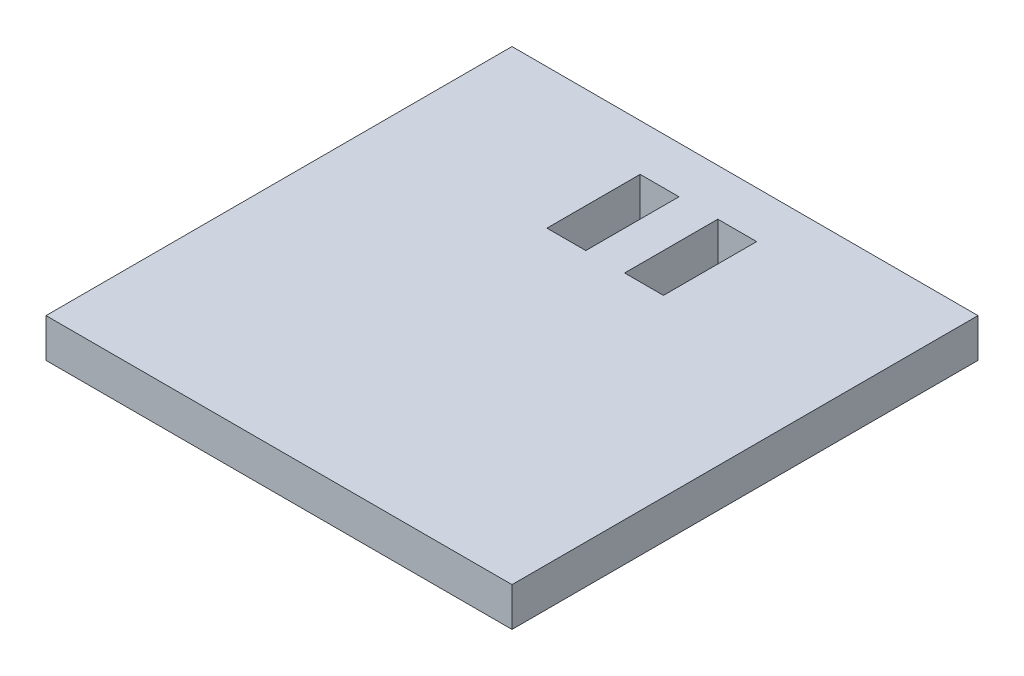
ISO-10303-21;
HEADER;
FILE_DESCRIPTION(('STEP AP214'),'2;1');
FILE_NAME('part.step','',(''),(''),'','','');
FILE_SCHEMA(('AUTOMOTIVE_DESIGN { 1 0 10303 214 1 1 1 1 }'));
ENDSEC;
DATA;
#1=APPLICATION_CONTEXT('core data for automotive mechanical design processes');
#2=APPLICATION_PROTOCOL_DEFINITION('international standard','automotive_design',2000,#1);
#3=PRODUCT_CONTEXT('',#1,'mechanical');
#4=PRODUCT('Part','Part','',(#3));
#5=PRODUCT_RELATED_PRODUCT_CATEGORY('part','',(#4));
#6=PRODUCT_DEFINITION_FORMATION('','',#4);
#7=PRODUCT_DEFINITION_CONTEXT('part definition',#1,'design');
#8=PRODUCT_DEFINITION('design','',#6,#7);
#9=PRODUCT_DEFINITION_SHAPE('','',#8);
#10=(LENGTH_UNIT() NAMED_UNIT(*) SI_UNIT(.MILLI.,.METRE.));
#11=(NAMED_UNIT(*) PLANE_ANGLE_UNIT() SI_UNIT($,.RADIAN.));
#12=(NAMED_UNIT(*) SI_UNIT($,.STERADIAN.) SOLID_ANGLE_UNIT());
#13=UNCERTAINTY_MEASURE_WITH_UNIT(LENGTH_MEASURE(1.E-05),#10,'distance_accuracy_value','');
#14=(GEOMETRIC_REPRESENTATION_CONTEXT(3) GLOBAL_UNCERTAINTY_ASSIGNED_CONTEXT((#13)) GLOBAL_UNIT_ASSIGNED_CONTEXT((#10,
#11,#12)) REPRESENTATION_CONTEXT('',''));
#15=CARTESIAN_POINT('',(0.,0.,0.));
#16=DIRECTION('',(0.,0.,1.));
#17=DIRECTION('',(1.,0.,0.));
#18=AXIS2_PLACEMENT_3D('',#15,#16,#17);
#19=CARTESIAN_POINT('',(0.,3.175,0.));
#20=DIRECTION('',(0.,-1.,0.));
#21=DIRECTION('',(0.,0.,-1.));
#22=AXIS2_PLACEMENT_3D('',#19,#20,#21);
#23=PLANE('',#22);
#24=DIRECTION('',(0.,0.,1.));
#25=VECTOR('',#24,1.);
#26=CARTESIAN_POINT('',(14.2875,3.175,-34.29));
#27=LINE('',#26,#25);
#28=CARTESIAN_POINT('',(14.2875,3.175,-34.29));
#29=VERTEX_POINT('',#28);
#30=CARTESIAN_POINT('',(14.2875,3.175,-26.67));
#31=VERTEX_POINT('',#30);
#32=EDGE_CURVE('E164',#29,#31,#27,.T.);
#33=ORIENTED_EDGE('',*,*,#32,.F.);
#34=DIRECTION('',(-1.,0.,0.));
#35=VECTOR('',#34,1.);
#36=CARTESIAN_POINT('',(14.2875,3.175,-34.29));
#37=LINE('',#36,#35);
#38=CARTESIAN_POINT('',(17.4625,3.175,-34.29));
#39=VERTEX_POINT('',#38);
#40=EDGE_CURVE('E172',#39,#29,#37,.T.);
#41=ORIENTED_EDGE('',*,*,#40,.F.);
#42=DIRECTION('',(0.,0.,-1.));
#43=VECTOR('',#42,1.);
#44=CARTESIAN_POINT('',(17.4625,3.175,-34.29));
#45=LINE('',#44,#43);
#46=CARTESIAN_POINT('',(17.4625,3.175,-26.67));
#47=VERTEX_POINT('',#46);
#48=EDGE_CURVE('E169',#47,#39,#45,.T.);
#49=ORIENTED_EDGE('',*,*,#48,.F.);
#50=DIRECTION('',(1.,0.,0.));
#51=VECTOR('',#50,1.);
#52=CARTESIAN_POINT('',(14.2875,3.175,-26.67));
#53=LINE('',#52,#51);
#54=EDGE_CURVE('E166',#31,#47,#53,.T.);
#55=ORIENTED_EDGE('',*,*,#54,.F.);
#56=EDGE_LOOP('',(#33,#41,#49,#55));
#57=FACE_BOUND('',#56,.T.);
#58=DIRECTION('',(0.,0.,1.));
#59=VECTOR('',#58,1.);
#60=CARTESIAN_POINT('',(0.,3.175,0.));
#61=LINE('',#60,#59);
#62=CARTESIAN_POINT('',(0.,3.175,-38.1));
#63=VERTEX_POINT('',#62);
#64=CARTESIAN_POINT('',(0.,3.175,0.));
#65=VERTEX_POINT('',#64);
#66=EDGE_CURVE('E195',#63,#65,#61,.T.);
#67=ORIENTED_EDGE('',*,*,#66,.T.);
#68=DIRECTION('',(1.,0.,0.));
#69=VECTOR('',#68,1.);
#70=CARTESIAN_POINT('',(0.,3.175,0.));
#71=LINE('',#70,#69);
#72=CARTESIAN_POINT('',(38.1,3.175,0.));
#73=VERTEX_POINT('',#72);
#74=EDGE_CURVE('E198',#65,#73,#71,.T.);
#75=ORIENTED_EDGE('',*,*,#74,.T.);
#76=DIRECTION('',(0.,0.,-1.));
#77=VECTOR('',#76,1.);
#78=CARTESIAN_POINT('',(38.1,3.175,0.));
#79=LINE('',#78,#77);
#80=CARTESIAN_POINT('',(38.1,3.175,-38.1));
#81=VERTEX_POINT('',#80);
#82=EDGE_CURVE('E201',#73,#81,#79,.T.);
#83=ORIENTED_EDGE('',*,*,#82,.T.);
#84=DIRECTION('',(-1.,0.,0.));
#85=VECTOR('',#84,1.);
#86=CARTESIAN_POINT('',(0.,3.175,-38.1));
#87=LINE('',#86,#85);
#88=EDGE_CURVE('E203',#81,#63,#87,.T.);
#89=ORIENTED_EDGE('',*,*,#88,.T.);
#90=EDGE_LOOP('',(#67,#75,#83,#89));
#91=FACE_BOUND('',#90,.T.);
#92=DIRECTION('',(0.,0.,1.));
#93=VECTOR('',#92,1.);
#94=CARTESIAN_POINT('',(20.6375,3.175,-34.29));
#95=LINE('',#94,#93);
#96=CARTESIAN_POINT('',(20.6375,3.175,-34.29));
#97=VERTEX_POINT('',#96);
#98=CARTESIAN_POINT('',(20.6375,3.175,-26.67));
#99=VERTEX_POINT('',#98);
#100=EDGE_CURVE('E128',#97,#99,#95,.T.);
#101=ORIENTED_EDGE('',*,*,#100,.F.);
#102=DIRECTION('',(-1.,0.,0.));
#103=VECTOR('',#102,1.);
#104=CARTESIAN_POINT('',(20.6375,3.175,-34.29));
#105=LINE('',#104,#103);
#106=CARTESIAN_POINT('',(23.8125,3.175,-34.29));
#107=VERTEX_POINT('',#106);
#108=EDGE_CURVE('E150',#107,#97,#105,.T.);
#109=ORIENTED_EDGE('',*,*,#108,.F.);
#110=DIRECTION('',(0.,0.,-1.));
#111=VECTOR('',#110,1.);
#112=CARTESIAN_POINT('',(23.8125,3.175,-34.29));
#113=LINE('',#112,#111);
#114=CARTESIAN_POINT('',(23.8125,3.175,-26.67));
#115=VERTEX_POINT('',#114);
#116=EDGE_CURVE('E148',#115,#107,#113,.T.);
#117=ORIENTED_EDGE('',*,*,#116,.F.);
#118=DIRECTION('',(1.,0.,0.));
#119=VECTOR('',#118,1.);
#120=CARTESIAN_POINT('',(20.6375,3.175,-26.67));
#121=LINE('',#120,#119);
#122=EDGE_CURVE('E136',#99,#115,#121,.T.);
#123=ORIENTED_EDGE('',*,*,#122,.F.);
#124=EDGE_LOOP('',(#101,#109,#117,#123));
#125=FACE_BOUND('',#124,.T.);
#126=ADVANCED_FACE('F39',(#57,#91,#125),#23,.F.);
#127=CARTESIAN_POINT('',(0.,0.,0.));
#128=DIRECTION('',(0.,-1.,0.));
#129=DIRECTION('',(0.,0.,-1.));
#130=AXIS2_PLACEMENT_3D('',#127,#128,#129);
#131=PLANE('',#130);
#132=DIRECTION('',(0.,0.,1.));
#133=VECTOR('',#132,1.);
#134=CARTESIAN_POINT('',(0.,0.,0.));
#135=LINE('',#134,#133);
#136=CARTESIAN_POINT('',(0.,0.,-38.1));
#137=VERTEX_POINT('',#136);
#138=CARTESIAN_POINT('',(0.,0.,0.));
#139=VERTEX_POINT('',#138);
#140=EDGE_CURVE('E194',#137,#139,#135,.T.);
#141=ORIENTED_EDGE('',*,*,#140,.F.);
#142=DIRECTION('',(-1.,0.,0.));
#143=VECTOR('',#142,1.);
#144=CARTESIAN_POINT('',(0.,0.,-38.1));
#145=LINE('',#144,#143);
#146=CARTESIAN_POINT('',(38.1,0.,-38.1));
#147=VERTEX_POINT('',#146);
#148=EDGE_CURVE('E199',#147,#137,#145,.T.);
#149=ORIENTED_EDGE('',*,*,#148,.F.);
#150=DIRECTION('',(0.,0.,-1.));
#151=VECTOR('',#150,1.);
#152=CARTESIAN_POINT('',(38.1,0.,0.));
#153=LINE('',#152,#151);
#154=CARTESIAN_POINT('',(38.1,0.,0.));
#155=VERTEX_POINT('',#154);
#156=EDGE_CURVE('E210',#155,#147,#153,.T.);
#157=ORIENTED_EDGE('',*,*,#156,.F.);
#158=DIRECTION('',(1.,0.,0.));
#159=VECTOR('',#158,1.);
#160=CARTESIAN_POINT('',(0.,0.,0.));
#161=LINE('',#160,#159);
#162=EDGE_CURVE('E208',#139,#155,#161,.T.);
#163=ORIENTED_EDGE('',*,*,#162,.F.);
#164=EDGE_LOOP('',(#141,#149,#157,#163));
#165=FACE_BOUND('',#164,.T.);
#166=DIRECTION('',(-1.,0.,0.));
#167=VECTOR('',#166,1.);
#168=CARTESIAN_POINT('',(14.2875,0.,-34.29));
#169=LINE('',#168,#167);
#170=CARTESIAN_POINT('',(17.4625,0.,-34.29));
#171=VERTEX_POINT('',#170);
#172=CARTESIAN_POINT('',(14.2875,0.,-34.29));
#173=VERTEX_POINT('',#172);
#174=EDGE_CURVE('E167',#171,#173,#169,.T.);
#175=ORIENTED_EDGE('',*,*,#174,.T.);
#176=DIRECTION('',(0.,0.,1.));
#177=VECTOR('',#176,1.);
#178=CARTESIAN_POINT('',(14.2875,0.,-34.29));
#179=LINE('',#178,#177);
#180=CARTESIAN_POINT('',(14.2875,0.,-26.67));
#181=VERTEX_POINT('',#180);
#182=EDGE_CURVE('E144',#173,#181,#179,.T.);
#183=ORIENTED_EDGE('',*,*,#182,.T.);
#184=DIRECTION('',(1.,0.,0.));
#185=VECTOR('',#184,1.);
#186=CARTESIAN_POINT('',(14.2875,0.,-26.67));
#187=LINE('',#186,#185);
#188=CARTESIAN_POINT('',(17.4625,0.,-26.67));
#189=VERTEX_POINT('',#188);
#190=EDGE_CURVE('E177',#181,#189,#187,.T.);
#191=ORIENTED_EDGE('',*,*,#190,.T.);
#192=DIRECTION('',(0.,0.,-1.));
#193=VECTOR('',#192,1.);
#194=CARTESIAN_POINT('',(17.4625,0.,-34.29));
#195=LINE('',#194,#193);
#196=EDGE_CURVE('E180',#189,#171,#195,.T.);
#197=ORIENTED_EDGE('',*,*,#196,.T.);
#198=EDGE_LOOP('',(#175,#183,#191,#197));
#199=FACE_BOUND('',#198,.T.);
#200=DIRECTION('',(-1.,0.,0.));
#201=VECTOR('',#200,1.);
#202=CARTESIAN_POINT('',(20.6375,0.,-34.29));
#203=LINE('',#202,#201);
#204=CARTESIAN_POINT('',(23.8125,0.,-34.29));
#205=VERTEX_POINT('',#204);
#206=CARTESIAN_POINT('',(20.6375,0.,-34.29));
#207=VERTEX_POINT('',#206);
#208=EDGE_CURVE('E137',#205,#207,#203,.T.);
#209=ORIENTED_EDGE('',*,*,#208,.T.);
#210=DIRECTION('',(0.,0.,1.));
#211=VECTOR('',#210,1.);
#212=CARTESIAN_POINT('',(20.6375,0.,-34.29));
#213=LINE('',#212,#211);
#214=CARTESIAN_POINT('',(20.6375,0.,-26.67));
#215=VERTEX_POINT('',#214);
#216=EDGE_CURVE('E62',#207,#215,#213,.T.);
#217=ORIENTED_EDGE('',*,*,#216,.T.);
#218=DIRECTION('',(1.,0.,0.));
#219=VECTOR('',#218,1.);
#220=CARTESIAN_POINT('',(20.6375,0.,-26.67));
#221=LINE('',#220,#219);
#222=CARTESIAN_POINT('',(23.8125,0.,-26.67));
#223=VERTEX_POINT('',#222);
#224=EDGE_CURVE('E143',#215,#223,#221,.T.);
#225=ORIENTED_EDGE('',*,*,#224,.T.);
#226=DIRECTION('',(0.,0.,-1.));
#227=VECTOR('',#226,1.);
#228=CARTESIAN_POINT('',(23.8125,0.,-34.29));
#229=LINE('',#228,#227);
#230=EDGE_CURVE('E156',#223,#205,#229,.T.);
#231=ORIENTED_EDGE('',*,*,#230,.T.);
#232=EDGE_LOOP('',(#209,#217,#225,#231));
#233=FACE_BOUND('',#232,.T.);
#234=ADVANCED_FACE('F228',(#165,#199,#233),#131,.T.);
#235=CARTESIAN_POINT('',(0.,3.175,0.));
#236=DIRECTION('',(1.,0.,0.));
#237=DIRECTION('',(0.,0.,-1.));
#238=AXIS2_PLACEMENT_3D('',#235,#236,#237);
#239=PLANE('',#238);
#240=ORIENTED_EDGE('',*,*,#140,.T.);
#241=DIRECTION('',(0.,-1.,0.));
#242=VECTOR('',#241,1.);
#243=CARTESIAN_POINT('',(0.,3.175,0.));
#244=LINE('',#243,#242);
#245=EDGE_CURVE('E11',#65,#139,#244,.T.);
#246=ORIENTED_EDGE('',*,*,#245,.F.);
#247=ORIENTED_EDGE('',*,*,#66,.F.);
#248=DIRECTION('',(0.,-1.,0.));
#249=VECTOR('',#248,1.);
#250=CARTESIAN_POINT('',(0.,3.175,-38.1));
#251=LINE('',#250,#249);
#252=EDGE_CURVE('E205',#63,#137,#251,.T.);
#253=ORIENTED_EDGE('',*,*,#252,.T.);
#254=EDGE_LOOP('',(#240,#246,#247,#253));
#255=FACE_BOUND('',#254,.T.);
#256=ADVANCED_FACE('F41',(#255),#239,.F.);
#257=CARTESIAN_POINT('',(0.,3.175,0.));
#258=DIRECTION('',(0.,0.,-1.));
#259=DIRECTION('',(-1.,0.,0.));
#260=AXIS2_PLACEMENT_3D('',#257,#258,#259);
#261=PLANE('',#260);
#262=ORIENTED_EDGE('',*,*,#162,.T.);
#263=DIRECTION('',(0.,-1.,0.));
#264=VECTOR('',#263,1.);
#265=CARTESIAN_POINT('',(38.1,3.175,0.));
#266=LINE('',#265,#264);
#267=EDGE_CURVE('E47',#73,#155,#266,.T.);
#268=ORIENTED_EDGE('',*,*,#267,.F.);
#269=ORIENTED_EDGE('',*,*,#74,.F.);
#270=ORIENTED_EDGE('',*,*,#245,.T.);
#271=EDGE_LOOP('',(#262,#268,#269,#270));
#272=FACE_BOUND('',#271,.T.);
#273=ADVANCED_FACE('F238',(#272),#261,.F.);
#274=CARTESIAN_POINT('',(38.1,3.175,0.));
#275=DIRECTION('',(-1.,0.,0.));
#276=DIRECTION('',(0.,0.,1.));
#277=AXIS2_PLACEMENT_3D('',#274,#275,#276);
#278=PLANE('',#277);
#279=ORIENTED_EDGE('',*,*,#156,.T.);
#280=DIRECTION('',(0.,-1.,0.));
#281=VECTOR('',#280,1.);
#282=CARTESIAN_POINT('',(38.1,3.175,-38.1));
#283=LINE('',#282,#281);
#284=EDGE_CURVE('E215',#81,#147,#283,.T.);
#285=ORIENTED_EDGE('',*,*,#284,.F.);
#286=ORIENTED_EDGE('',*,*,#82,.F.);
#287=ORIENTED_EDGE('',*,*,#267,.T.);
#288=EDGE_LOOP('',(#279,#285,#286,#287));
#289=FACE_BOUND('',#288,.T.);
#290=ADVANCED_FACE('F222',(#289),#278,.F.);
#291=CARTESIAN_POINT('',(0.,3.175,-38.1));
#292=DIRECTION('',(0.,0.,1.));
#293=DIRECTION('',(1.,0.,0.));
#294=AXIS2_PLACEMENT_3D('',#291,#292,#293);
#295=PLANE('',#294);
#296=ORIENTED_EDGE('',*,*,#148,.T.);
#297=ORIENTED_EDGE('',*,*,#252,.F.);
#298=ORIENTED_EDGE('',*,*,#88,.F.);
#299=ORIENTED_EDGE('',*,*,#284,.T.);
#300=EDGE_LOOP('',(#296,#297,#298,#299));
#301=FACE_BOUND('',#300,.T.);
#302=ADVANCED_FACE('F232',(#301),#295,.F.);
#303=CARTESIAN_POINT('',(14.2875,3.175,-34.29));
#304=DIRECTION('',(1.,0.,0.));
#305=DIRECTION('',(0.,0.,-1.));
#306=AXIS2_PLACEMENT_3D('',#303,#304,#305);
#307=PLANE('',#306);
#308=ORIENTED_EDGE('',*,*,#182,.F.);
#309=DIRECTION('',(0.,-1.,0.));
#310=VECTOR('',#309,1.);
#311=CARTESIAN_POINT('',(14.2875,3.175,-34.29));
#312=LINE('',#311,#310);
#313=EDGE_CURVE('E174',#29,#173,#312,.T.);
#314=ORIENTED_EDGE('',*,*,#313,.F.);
#315=ORIENTED_EDGE('',*,*,#32,.T.);
#316=DIRECTION('',(0.,-1.,0.));
#317=VECTOR('',#316,1.);
#318=CARTESIAN_POINT('',(14.2875,3.175,-26.67));
#319=LINE('',#318,#317);
#320=EDGE_CURVE('E191',#31,#181,#319,.T.);
#321=ORIENTED_EDGE('',*,*,#320,.T.);
#322=EDGE_LOOP('',(#308,#314,#315,#321));
#323=FACE_BOUND('',#322,.T.);
#324=ADVANCED_FACE('F254',(#323),#307,.T.);
#325=CARTESIAN_POINT('',(14.2875,3.175,-26.67));
#326=DIRECTION('',(0.,0.,-1.));
#327=DIRECTION('',(-1.,0.,0.));
#328=AXIS2_PLACEMENT_3D('',#325,#326,#327);
#329=PLANE('',#328);
#330=ORIENTED_EDGE('',*,*,#190,.F.);
#331=ORIENTED_EDGE('',*,*,#320,.F.);
#332=ORIENTED_EDGE('',*,*,#54,.T.);
#333=DIRECTION('',(0.,-1.,0.));
#334=VECTOR('',#333,1.);
#335=CARTESIAN_POINT('',(17.4625,3.175,-26.67));
#336=LINE('',#335,#334);
#337=EDGE_CURVE('E189',#47,#189,#336,.T.);
#338=ORIENTED_EDGE('',*,*,#337,.T.);
#339=EDGE_LOOP('',(#330,#331,#332,#338));
#340=FACE_BOUND('',#339,.T.);
#341=ADVANCED_FACE('F261',(#340),#329,.T.);
#342=CARTESIAN_POINT('',(17.4625,3.175,-34.29));
#343=DIRECTION('',(-1.,0.,0.));
#344=DIRECTION('',(0.,0.,1.));
#345=AXIS2_PLACEMENT_3D('',#342,#343,#344);
#346=PLANE('',#345);
#347=ORIENTED_EDGE('',*,*,#196,.F.);
#348=ORIENTED_EDGE('',*,*,#337,.F.);
#349=ORIENTED_EDGE('',*,*,#48,.T.);
#350=DIRECTION('',(0.,-1.,0.));
#351=VECTOR('',#350,1.);
#352=CARTESIAN_POINT('',(17.4625,3.175,-34.29));
#353=LINE('',#352,#351);
#354=EDGE_CURVE('E187',#39,#171,#353,.T.);
#355=ORIENTED_EDGE('',*,*,#354,.T.);
#356=EDGE_LOOP('',(#347,#348,#349,#355));
#357=FACE_BOUND('',#356,.T.);
#358=ADVANCED_FACE('F266',(#357),#346,.T.);
#359=CARTESIAN_POINT('',(14.2875,3.175,-34.29));
#360=DIRECTION('',(0.,0.,1.));
#361=DIRECTION('',(1.,0.,0.));
#362=AXIS2_PLACEMENT_3D('',#359,#360,#361);
#363=PLANE('',#362);
#364=ORIENTED_EDGE('',*,*,#174,.F.);
#365=ORIENTED_EDGE('',*,*,#354,.F.);
#366=ORIENTED_EDGE('',*,*,#40,.T.);
#367=ORIENTED_EDGE('',*,*,#313,.T.);
#368=EDGE_LOOP('',(#364,#365,#366,#367));
#369=FACE_BOUND('',#368,.T.);
#370=ADVANCED_FACE('F272',(#369),#363,.T.);
#371=CARTESIAN_POINT('',(20.6375,3.175,-34.29));
#372=DIRECTION('',(1.,0.,0.));
#373=DIRECTION('',(0.,0.,-1.));
#374=AXIS2_PLACEMENT_3D('',#371,#372,#373);
#375=PLANE('',#374);
#376=ORIENTED_EDGE('',*,*,#216,.F.);
#377=DIRECTION('',(0.,-1.,0.));
#378=VECTOR('',#377,1.);
#379=CARTESIAN_POINT('',(20.6375,3.175,-34.29));
#380=LINE('',#379,#378);
#381=EDGE_CURVE('E132',#97,#207,#380,.T.);
#382=ORIENTED_EDGE('',*,*,#381,.F.);
#383=ORIENTED_EDGE('',*,*,#100,.T.);
#384=DIRECTION('',(0.,-1.,0.));
#385=VECTOR('',#384,1.);
#386=CARTESIAN_POINT('',(20.6375,3.175,-26.67));
#387=LINE('',#386,#385);
#388=EDGE_CURVE('E131',#99,#215,#387,.T.);
#389=ORIENTED_EDGE('',*,*,#388,.T.);
#390=EDGE_LOOP('',(#376,#382,#383,#389));
#391=FACE_BOUND('',#390,.T.);
#392=ADVANCED_FACE('F130',(#391),#375,.T.);
#393=CARTESIAN_POINT('',(20.6375,3.175,-26.67));
#394=DIRECTION('',(0.,0.,-1.));
#395=DIRECTION('',(-1.,0.,0.));
#396=AXIS2_PLACEMENT_3D('',#393,#394,#395);
#397=PLANE('',#396);
#398=ORIENTED_EDGE('',*,*,#224,.F.);
#399=ORIENTED_EDGE('',*,*,#388,.F.);
#400=ORIENTED_EDGE('',*,*,#122,.T.);
#401=DIRECTION('',(0.,-1.,0.));
#402=VECTOR('',#401,1.);
#403=CARTESIAN_POINT('',(23.8125,3.175,-26.67));
#404=LINE('',#403,#402);
#405=EDGE_CURVE('E145',#115,#223,#404,.T.);
#406=ORIENTED_EDGE('',*,*,#405,.T.);
#407=EDGE_LOOP('',(#398,#399,#400,#406));
#408=FACE_BOUND('',#407,.T.);
#409=ADVANCED_FACE('F140',(#408),#397,.T.);
#410=CARTESIAN_POINT('',(23.8125,3.175,-34.29));
#411=DIRECTION('',(-1.,0.,0.));
#412=DIRECTION('',(0.,0.,1.));
#413=AXIS2_PLACEMENT_3D('',#410,#411,#412);
#414=PLANE('',#413);
#415=ORIENTED_EDGE('',*,*,#230,.F.);
#416=ORIENTED_EDGE('',*,*,#405,.F.);
#417=ORIENTED_EDGE('',*,*,#116,.T.);
#418=DIRECTION('',(0.,-1.,0.));
#419=VECTOR('',#418,1.);
#420=CARTESIAN_POINT('',(23.8125,3.175,-34.29));
#421=LINE('',#420,#419);
#422=EDGE_CURVE('E54',#107,#205,#421,.T.);
#423=ORIENTED_EDGE('',*,*,#422,.T.);
#424=EDGE_LOOP('',(#415,#416,#417,#423));
#425=FACE_BOUND('',#424,.T.);
#426=ADVANCED_FACE('F291',(#425),#414,.T.);
#427=CARTESIAN_POINT('',(20.6375,3.175,-34.29));
#428=DIRECTION('',(0.,0.,1.));
#429=DIRECTION('',(1.,0.,0.));
#430=AXIS2_PLACEMENT_3D('',#427,#428,#429);
#431=PLANE('',#430);
#432=ORIENTED_EDGE('',*,*,#208,.F.);
#433=ORIENTED_EDGE('',*,*,#422,.F.);
#434=ORIENTED_EDGE('',*,*,#108,.T.);
#435=ORIENTED_EDGE('',*,*,#381,.T.);
#436=EDGE_LOOP('',(#432,#433,#434,#435));
#437=FACE_BOUND('',#436,.T.);
#438=ADVANCED_FACE('F294',(#437),#431,.T.);
#439=CLOSED_SHELL('',(#126,#234,#256,#273,#290,#302,#324,#341,#358,#370,#392,#409,#426,#438));
#440=MANIFOLD_SOLID_BREP('B2',#439);
#441=ADVANCED_BREP_SHAPE_REPRESENTATION('',(#18,#440),#14);
#442=SHAPE_DEFINITION_REPRESENTATION(#9,#441);
ENDSEC;
END-ISO-10303-21;
